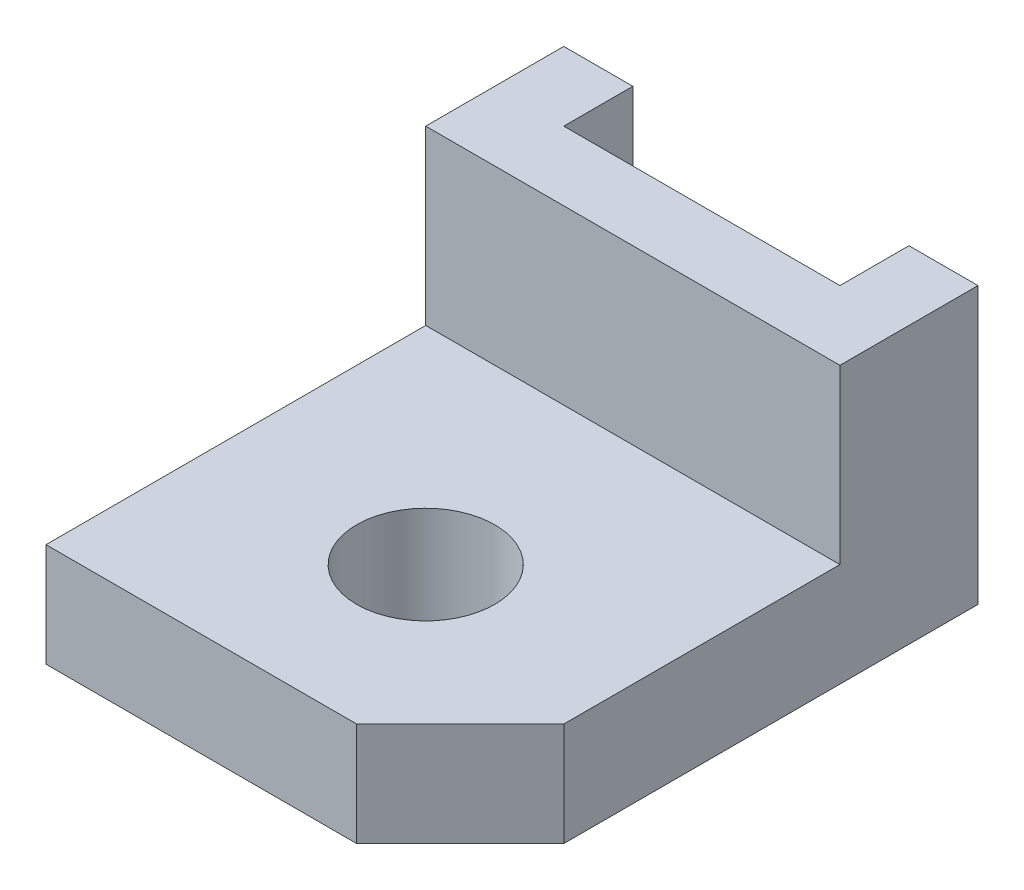
ISO-10303-21;
HEADER;
FILE_DESCRIPTION(('STEP AP214'),'2;1');
FILE_NAME('part.step','',(''),(''),'','','');
FILE_SCHEMA(('AUTOMOTIVE_DESIGN { 1 0 10303 214 1 1 1 1 }'));
ENDSEC;
DATA;
#1=APPLICATION_CONTEXT('core data for automotive mechanical design processes');
#2=APPLICATION_PROTOCOL_DEFINITION('international standard','automotive_design',2000,#1);
#3=PRODUCT_CONTEXT('',#1,'mechanical');
#4=PRODUCT('Part','Part','',(#3));
#5=PRODUCT_RELATED_PRODUCT_CATEGORY('part','',(#4));
#6=PRODUCT_DEFINITION_FORMATION('','',#4);
#7=PRODUCT_DEFINITION_CONTEXT('part definition',#1,'design');
#8=PRODUCT_DEFINITION('design','',#6,#7);
#9=PRODUCT_DEFINITION_SHAPE('','',#8);
#10=(LENGTH_UNIT() NAMED_UNIT(*) SI_UNIT(.MILLI.,.METRE.));
#11=(NAMED_UNIT(*) PLANE_ANGLE_UNIT() SI_UNIT($,.RADIAN.));
#12=(NAMED_UNIT(*) SI_UNIT($,.STERADIAN.) SOLID_ANGLE_UNIT());
#13=UNCERTAINTY_MEASURE_WITH_UNIT(LENGTH_MEASURE(1.E-05),#10,'distance_accuracy_value','');
#14=(GEOMETRIC_REPRESENTATION_CONTEXT(3) GLOBAL_UNCERTAINTY_ASSIGNED_CONTEXT((#13)) GLOBAL_UNIT_ASSIGNED_CONTEXT((#10,
#11,#12)) REPRESENTATION_CONTEXT('',''));
#15=CARTESIAN_POINT('',(0.,0.,0.));
#16=DIRECTION('',(0.,0.,1.));
#17=DIRECTION('',(1.,0.,0.));
#18=AXIS2_PLACEMENT_3D('',#15,#16,#17);
#19=CARTESIAN_POINT('',(30.,15.,-50.));
#20=DIRECTION('',(0.,0.,1.));
#21=DIRECTION('',(1.,0.,0.));
#22=AXIS2_PLACEMENT_3D('',#19,#20,#21);
#23=PLANE('',#22);
#24=DIRECTION('',(0.,-1.,0.));
#25=VECTOR('',#24,1.);
#26=CARTESIAN_POINT('',(-20.,40.,-50.));
#27=LINE('',#26,#25);
#28=CARTESIAN_POINT('',(-20.,40.,-50.));
#29=VERTEX_POINT('',#28);
#30=CARTESIAN_POINT('',(-20.,0.,-50.));
#31=VERTEX_POINT('',#30);
#32=EDGE_CURVE('E173',#29,#31,#27,.T.);
#33=ORIENTED_EDGE('',*,*,#32,.T.);
#34=DIRECTION('',(-1.,0.,0.));
#35=VECTOR('',#34,1.);
#36=CARTESIAN_POINT('',(30.,0.,-50.));
#37=LINE('',#36,#35);
#38=CARTESIAN_POINT('',(-30.,0.,-50.));
#39=VERTEX_POINT('',#38);
#40=EDGE_CURVE('E195',#31,#39,#37,.T.);
#41=ORIENTED_EDGE('',*,*,#40,.T.);
#42=DIRECTION('',(0.,-1.,0.));
#43=VECTOR('',#42,1.);
#44=CARTESIAN_POINT('',(-30.,15.,-50.));
#45=LINE('',#44,#43);
#46=CARTESIAN_POINT('',(-30.,40.,-50.));
#47=VERTEX_POINT('',#46);
#48=EDGE_CURVE('E47',#47,#39,#45,.T.);
#49=ORIENTED_EDGE('',*,*,#48,.F.);
#50=DIRECTION('',(-1.,0.,0.));
#51=VECTOR('',#50,1.);
#52=CARTESIAN_POINT('',(-30.,40.,-50.));
#53=LINE('',#52,#51);
#54=EDGE_CURVE('E156',#29,#47,#53,.T.);
#55=ORIENTED_EDGE('',*,*,#54,.F.);
#56=EDGE_LOOP('',(#33,#41,#49,#55));
#57=FACE_BOUND('',#56,.T.);
#58=ADVANCED_FACE('F39',(#57),#23,.F.);
#59=CARTESIAN_POINT('',(0.,15.,0.));
#60=DIRECTION('',(0.,1.,0.));
#61=DIRECTION('',(0.,0.,1.));
#62=AXIS2_PLACEMENT_3D('',#59,#60,#61);
#63=PLANE('',#62);
#64=DIRECTION('',(1.,0.,0.));
#65=VECTOR('',#64,1.);
#66=CARTESIAN_POINT('',(30.,15.,-30.));
#67=LINE('',#66,#65);
#68=CARTESIAN_POINT('',(-30.,15.,-30.));
#69=VERTEX_POINT('',#68);
#70=CARTESIAN_POINT('',(30.,15.,-30.));
#71=VERTEX_POINT('',#70);
#72=EDGE_CURVE('E54',#69,#71,#67,.T.);
#73=ORIENTED_EDGE('',*,*,#72,.F.);
#74=DIRECTION('',(0.,0.,1.));
#75=VECTOR('',#74,1.);
#76=CARTESIAN_POINT('',(-30.,15.,-50.));
#77=LINE('',#76,#75);
#78=CARTESIAN_POINT('',(-30.,15.,25.));
#79=VERTEX_POINT('',#78);
#80=EDGE_CURVE('E185',#69,#79,#77,.T.);
#81=ORIENTED_EDGE('',*,*,#80,.T.);
#82=DIRECTION('',(1.,0.,0.));
#83=VECTOR('',#82,1.);
#84=CARTESIAN_POINT('',(-30.,15.,25.));
#85=LINE('',#84,#83);
#86=CARTESIAN_POINT('',(15.,15.,25.));
#87=VERTEX_POINT('',#86);
#88=EDGE_CURVE('E188',#79,#87,#85,.T.);
#89=ORIENTED_EDGE('',*,*,#88,.T.);
#90=DIRECTION('',(0.707106781186547,0.,-0.707106781186548));
#91=VECTOR('',#90,1.);
#92=CARTESIAN_POINT('',(15.,15.,25.));
#93=LINE('',#92,#91);
#94=CARTESIAN_POINT('',(30.,15.,10.));
#95=VERTEX_POINT('',#94);
#96=EDGE_CURVE('E190',#87,#95,#93,.T.);
#97=ORIENTED_EDGE('',*,*,#96,.T.);
#98=DIRECTION('',(0.,0.,-1.));
#99=VECTOR('',#98,1.);
#100=CARTESIAN_POINT('',(30.,15.,10.));
#101=LINE('',#100,#99);
#102=EDGE_CURVE('E59',#95,#71,#101,.T.);
#103=ORIENTED_EDGE('',*,*,#102,.T.);
#104=EDGE_LOOP('',(#73,#81,#89,#97,#103));
#105=FACE_BOUND('',#104,.T.);
#106=CARTESIAN_POINT('',(0.,15.,0.));
#107=DIRECTION('',(0.,1.,0.));
#108=DIRECTION('',(0.,0.,1.));
#109=AXIS2_PLACEMENT_3D('',#106,#107,#108);
#110=CIRCLE('',#109,10.);
#111=CARTESIAN_POINT('',(0.,15.,10.));
#112=VERTEX_POINT('',#111);
#113=EDGE_CURVE('E178',#112,#112,#110,.T.);
#114=ORIENTED_EDGE('',*,*,#113,.F.);
#115=EDGE_LOOP('',(#114));
#116=FACE_BOUND('',#115,.T.);
#117=ADVANCED_FACE('F230',(#105,#116),#63,.T.);
#118=CARTESIAN_POINT('',(0.,0.,0.));
#119=DIRECTION('',(0.,1.,0.));
#120=DIRECTION('',(0.,0.,1.));
#121=AXIS2_PLACEMENT_3D('',#118,#119,#120);
#122=PLANE('',#121);
#123=ORIENTED_EDGE('',*,*,#40,.F.);
#124=DIRECTION('',(0.,0.,1.));
#125=VECTOR('',#124,1.);
#126=CARTESIAN_POINT('',(-20.,0.,-50.));
#127=LINE('',#126,#125);
#128=CARTESIAN_POINT('',(-20.,0.,-40.));
#129=VERTEX_POINT('',#128);
#130=EDGE_CURVE('E139',#31,#129,#127,.T.);
#131=ORIENTED_EDGE('',*,*,#130,.T.);
#132=DIRECTION('',(1.,0.,0.));
#133=VECTOR('',#132,1.);
#134=CARTESIAN_POINT('',(-20.,0.,-40.));
#135=LINE('',#134,#133);
#136=CARTESIAN_POINT('',(20.,0.,-40.));
#137=VERTEX_POINT('',#136);
#138=EDGE_CURVE('E126',#129,#137,#135,.T.);
#139=ORIENTED_EDGE('',*,*,#138,.T.);
#140=DIRECTION('',(0.,0.,-1.));
#141=VECTOR('',#140,1.);
#142=CARTESIAN_POINT('',(20.,0.,-40.));
#143=LINE('',#142,#141);
#144=CARTESIAN_POINT('',(20.,0.,-50.));
#145=VERTEX_POINT('',#144);
#146=EDGE_CURVE('E134',#137,#145,#143,.T.);
#147=ORIENTED_EDGE('',*,*,#146,.T.);
#148=CARTESIAN_POINT('',(30.,0.,-50.));
#149=VERTEX_POINT('',#148);
#150=EDGE_CURVE('E196',#149,#145,#37,.T.);
#151=ORIENTED_EDGE('',*,*,#150,.F.);
#152=DIRECTION('',(0.,0.,-1.));
#153=VECTOR('',#152,1.);
#154=CARTESIAN_POINT('',(30.,0.,10.));
#155=LINE('',#154,#153);
#156=CARTESIAN_POINT('',(30.,0.,10.));
#157=VERTEX_POINT('',#156);
#158=EDGE_CURVE('E181',#157,#149,#155,.T.);
#159=ORIENTED_EDGE('',*,*,#158,.F.);
#160=DIRECTION('',(0.707106781186547,0.,-0.707106781186548));
#161=VECTOR('',#160,1.);
#162=CARTESIAN_POINT('',(15.,0.,25.));
#163=LINE('',#162,#161);
#164=CARTESIAN_POINT('',(15.,0.,25.));
#165=VERTEX_POINT('',#164);
#166=EDGE_CURVE('E186',#165,#157,#163,.T.);
#167=ORIENTED_EDGE('',*,*,#166,.F.);
#168=DIRECTION('',(1.,0.,0.));
#169=VECTOR('',#168,1.);
#170=CARTESIAN_POINT('',(-30.,0.,25.));
#171=LINE('',#170,#169);
#172=CARTESIAN_POINT('',(-30.,0.,25.));
#173=VERTEX_POINT('',#172);
#174=EDGE_CURVE('E200',#173,#165,#171,.T.);
#175=ORIENTED_EDGE('',*,*,#174,.F.);
#176=DIRECTION('',(0.,0.,1.));
#177=VECTOR('',#176,1.);
#178=CARTESIAN_POINT('',(-30.,0.,-50.));
#179=LINE('',#178,#177);
#180=EDGE_CURVE('E198',#39,#173,#179,.T.);
#181=ORIENTED_EDGE('',*,*,#180,.F.);
#182=EDGE_LOOP('',(#123,#131,#139,#147,#151,#159,#167,#175,#181));
#183=FACE_BOUND('',#182,.T.);
#184=CARTESIAN_POINT('',(0.,0.,0.));
#185=DIRECTION('',(0.,1.,0.));
#186=DIRECTION('',(0.,0.,1.));
#187=AXIS2_PLACEMENT_3D('',#184,#185,#186);
#188=CIRCLE('',#187,10.);
#189=CARTESIAN_POINT('',(0.,0.,10.));
#190=VERTEX_POINT('',#189);
#191=EDGE_CURVE('E177',#190,#190,#188,.T.);
#192=ORIENTED_EDGE('',*,*,#191,.T.);
#193=EDGE_LOOP('',(#192));
#194=FACE_BOUND('',#193,.T.);
#195=ADVANCED_FACE('F142',(#183,#194),#122,.F.);
#196=CARTESIAN_POINT('',(30.,15.,10.));
#197=DIRECTION('',(-1.,0.,0.));
#198=DIRECTION('',(0.,0.,1.));
#199=AXIS2_PLACEMENT_3D('',#196,#197,#198);
#200=PLANE('',#199);
#201=ORIENTED_EDGE('',*,*,#158,.T.);
#202=DIRECTION('',(0.,-1.,0.));
#203=VECTOR('',#202,1.);
#204=CARTESIAN_POINT('',(30.,15.,-50.));
#205=LINE('',#204,#203);
#206=CARTESIAN_POINT('',(30.,40.,-50.));
#207=VERTEX_POINT('',#206);
#208=EDGE_CURVE('E11',#207,#149,#205,.T.);
#209=ORIENTED_EDGE('',*,*,#208,.F.);
#210=DIRECTION('',(0.,0.,-1.));
#211=VECTOR('',#210,1.);
#212=CARTESIAN_POINT('',(30.,40.,-50.));
#213=LINE('',#212,#211);
#214=CARTESIAN_POINT('',(30.,40.,-30.));
#215=VERTEX_POINT('',#214);
#216=EDGE_CURVE('E163',#215,#207,#213,.T.);
#217=ORIENTED_EDGE('',*,*,#216,.F.);
#218=DIRECTION('',(0.,-1.,0.));
#219=VECTOR('',#218,1.);
#220=CARTESIAN_POINT('',(30.,40.,-30.));
#221=LINE('',#220,#219);
#222=EDGE_CURVE('E166',#215,#71,#221,.T.);
#223=ORIENTED_EDGE('',*,*,#222,.T.);
#224=ORIENTED_EDGE('',*,*,#102,.F.);
#225=DIRECTION('',(0.,-1.,0.));
#226=VECTOR('',#225,1.);
#227=CARTESIAN_POINT('',(30.,15.,10.));
#228=LINE('',#227,#226);
#229=EDGE_CURVE('E192',#95,#157,#228,.T.);
#230=ORIENTED_EDGE('',*,*,#229,.T.);
#231=EDGE_LOOP('',(#201,#209,#217,#223,#224,#230));
#232=FACE_BOUND('',#231,.T.);
#233=ADVANCED_FACE('F41',(#232),#200,.F.);
#234=ORIENTED_EDGE('',*,*,#150,.T.);
#235=DIRECTION('',(0.,-1.,0.));
#236=VECTOR('',#235,1.);
#237=CARTESIAN_POINT('',(20.,40.,-50.));
#238=LINE('',#237,#236);
#239=CARTESIAN_POINT('',(20.,40.,-50.));
#240=VERTEX_POINT('',#239);
#241=EDGE_CURVE('E130',#240,#145,#238,.T.);
#242=ORIENTED_EDGE('',*,*,#241,.F.);
#243=DIRECTION('',(-1.,0.,0.));
#244=VECTOR('',#243,1.);
#245=CARTESIAN_POINT('',(20.,40.,-50.));
#246=LINE('',#245,#244);
#247=EDGE_CURVE('E148',#207,#240,#246,.T.);
#248=ORIENTED_EDGE('',*,*,#247,.F.);
#249=ORIENTED_EDGE('',*,*,#208,.T.);
#250=EDGE_LOOP('',(#234,#242,#248,#249));
#251=FACE_BOUND('',#250,.T.);
#252=ADVANCED_FACE('F253',(#251),#23,.F.);
#253=CARTESIAN_POINT('',(-30.,15.,-50.));
#254=DIRECTION('',(1.,0.,0.));
#255=DIRECTION('',(0.,0.,-1.));
#256=AXIS2_PLACEMENT_3D('',#253,#254,#255);
#257=PLANE('',#256);
#258=ORIENTED_EDGE('',*,*,#180,.T.);
#259=DIRECTION('',(0.,-1.,0.));
#260=VECTOR('',#259,1.);
#261=CARTESIAN_POINT('',(-30.,15.,25.));
#262=LINE('',#261,#260);
#263=EDGE_CURVE('E208',#79,#173,#262,.T.);
#264=ORIENTED_EDGE('',*,*,#263,.F.);
#265=ORIENTED_EDGE('',*,*,#80,.F.);
#266=DIRECTION('',(0.,-1.,0.));
#267=VECTOR('',#266,1.);
#268=CARTESIAN_POINT('',(-30.,40.,-30.));
#269=LINE('',#268,#267);
#270=CARTESIAN_POINT('',(-30.,40.,-30.));
#271=VERTEX_POINT('',#270);
#272=EDGE_CURVE('E170',#271,#69,#269,.T.);
#273=ORIENTED_EDGE('',*,*,#272,.F.);
#274=DIRECTION('',(0.,0.,1.));
#275=VECTOR('',#274,1.);
#276=CARTESIAN_POINT('',(-30.,40.,-30.));
#277=LINE('',#276,#275);
#278=EDGE_CURVE('E159',#47,#271,#277,.T.);
#279=ORIENTED_EDGE('',*,*,#278,.F.);
#280=ORIENTED_EDGE('',*,*,#48,.T.);
#281=EDGE_LOOP('',(#258,#264,#265,#273,#279,#280));
#282=FACE_BOUND('',#281,.T.);
#283=ADVANCED_FACE('F214',(#282),#257,.F.);
#284=CARTESIAN_POINT('',(-30.,15.,25.));
#285=DIRECTION('',(0.,0.,-1.));
#286=DIRECTION('',(-1.,0.,0.));
#287=AXIS2_PLACEMENT_3D('',#284,#285,#286);
#288=PLANE('',#287);
#289=ORIENTED_EDGE('',*,*,#174,.T.);
#290=DIRECTION('',(0.,-1.,0.));
#291=VECTOR('',#290,1.);
#292=CARTESIAN_POINT('',(15.,15.,25.));
#293=LINE('',#292,#291);
#294=EDGE_CURVE('E205',#87,#165,#293,.T.);
#295=ORIENTED_EDGE('',*,*,#294,.F.);
#296=ORIENTED_EDGE('',*,*,#88,.F.);
#297=ORIENTED_EDGE('',*,*,#263,.T.);
#298=EDGE_LOOP('',(#289,#295,#296,#297));
#299=FACE_BOUND('',#298,.T.);
#300=ADVANCED_FACE('F224',(#299),#288,.F.);
#301=CARTESIAN_POINT('',(15.,15.,25.));
#302=DIRECTION('',(-0.707106781186548,0.,-0.707106781186547));
#303=DIRECTION('',(-0.707106781186547,0.,0.707106781186548));
#304=AXIS2_PLACEMENT_3D('',#301,#302,#303);
#305=PLANE('',#304);
#306=ORIENTED_EDGE('',*,*,#166,.T.);
#307=ORIENTED_EDGE('',*,*,#229,.F.);
#308=ORIENTED_EDGE('',*,*,#96,.F.);
#309=ORIENTED_EDGE('',*,*,#294,.T.);
#310=EDGE_LOOP('',(#306,#307,#308,#309));
#311=FACE_BOUND('',#310,.T.);
#312=ADVANCED_FACE('F228',(#311),#305,.F.);
#313=CARTESIAN_POINT('',(0.,15.,0.));
#314=DIRECTION('',(0.,-1.,0.));
#315=DIRECTION('',(0.,0.,-1.));
#316=AXIS2_PLACEMENT_3D('',#313,#314,#315);
#317=CYLINDRICAL_SURFACE('',#316,10.);
#318=ORIENTED_EDGE('',*,*,#113,.T.);
#319=EDGE_LOOP('',(#318));
#320=FACE_BOUND('',#319,.T.);
#321=ORIENTED_EDGE('',*,*,#191,.F.);
#322=EDGE_LOOP('',(#321));
#323=FACE_BOUND('',#322,.T.);
#324=ADVANCED_FACE('F278',(#320,#323),#317,.F.);
#325=CARTESIAN_POINT('',(20.,40.,-40.));
#326=DIRECTION('',(1.,0.,0.));
#327=DIRECTION('',(0.,0.,-1.));
#328=AXIS2_PLACEMENT_3D('',#325,#326,#327);
#329=PLANE('',#328);
#330=ORIENTED_EDGE('',*,*,#241,.T.);
#331=ORIENTED_EDGE('',*,*,#146,.F.);
#332=DIRECTION('',(0.,-1.,0.));
#333=VECTOR('',#332,1.);
#334=CARTESIAN_POINT('',(20.,40.,-40.));
#335=LINE('',#334,#333);
#336=CARTESIAN_POINT('',(20.,40.,-40.));
#337=VERTEX_POINT('',#336);
#338=EDGE_CURVE('E121',#337,#137,#335,.T.);
#339=ORIENTED_EDGE('',*,*,#338,.F.);
#340=DIRECTION('',(0.,0.,1.));
#341=VECTOR('',#340,1.);
#342=CARTESIAN_POINT('',(20.,40.,-40.));
#343=LINE('',#342,#341);
#344=EDGE_CURVE('E151',#240,#337,#343,.T.);
#345=ORIENTED_EDGE('',*,*,#344,.F.);
#346=EDGE_LOOP('',(#330,#331,#339,#345));
#347=FACE_BOUND('',#346,.T.);
#348=ADVANCED_FACE('F135',(#347),#329,.F.);
#349=CARTESIAN_POINT('',(-20.,40.,-40.));
#350=DIRECTION('',(0.,0.,1.));
#351=DIRECTION('',(1.,0.,0.));
#352=AXIS2_PLACEMENT_3D('',#349,#350,#351);
#353=PLANE('',#352);
#354=ORIENTED_EDGE('',*,*,#338,.T.);
#355=ORIENTED_EDGE('',*,*,#138,.F.);
#356=DIRECTION('',(0.,-1.,0.));
#357=VECTOR('',#356,1.);
#358=CARTESIAN_POINT('',(-20.,40.,-40.));
#359=LINE('',#358,#357);
#360=CARTESIAN_POINT('',(-20.,40.,-40.));
#361=VERTEX_POINT('',#360);
#362=EDGE_CURVE('E131',#361,#129,#359,.T.);
#363=ORIENTED_EDGE('',*,*,#362,.F.);
#364=DIRECTION('',(-1.,0.,0.));
#365=VECTOR('',#364,1.);
#366=CARTESIAN_POINT('',(-20.,40.,-40.));
#367=LINE('',#366,#365);
#368=EDGE_CURVE('E128',#337,#361,#367,.T.);
#369=ORIENTED_EDGE('',*,*,#368,.F.);
#370=EDGE_LOOP('',(#354,#355,#363,#369));
#371=FACE_BOUND('',#370,.T.);
#372=ADVANCED_FACE('F123',(#371),#353,.F.);
#373=CARTESIAN_POINT('',(-20.,40.,-50.));
#374=DIRECTION('',(-1.,0.,0.));
#375=DIRECTION('',(0.,0.,1.));
#376=AXIS2_PLACEMENT_3D('',#373,#374,#375);
#377=PLANE('',#376);
#378=ORIENTED_EDGE('',*,*,#362,.T.);
#379=ORIENTED_EDGE('',*,*,#130,.F.);
#380=ORIENTED_EDGE('',*,*,#32,.F.);
#381=DIRECTION('',(0.,0.,-1.));
#382=VECTOR('',#381,1.);
#383=CARTESIAN_POINT('',(-20.,40.,-50.));
#384=LINE('',#383,#382);
#385=EDGE_CURVE('E154',#361,#29,#384,.T.);
#386=ORIENTED_EDGE('',*,*,#385,.F.);
#387=EDGE_LOOP('',(#378,#379,#380,#386));
#388=FACE_BOUND('',#387,.T.);
#389=ADVANCED_FACE('F243',(#388),#377,.F.);
#390=CARTESIAN_POINT('',(30.,40.,-30.));
#391=DIRECTION('',(0.,0.,-1.));
#392=DIRECTION('',(-1.,0.,0.));
#393=AXIS2_PLACEMENT_3D('',#390,#391,#392);
#394=PLANE('',#393);
#395=ORIENTED_EDGE('',*,*,#72,.T.);
#396=ORIENTED_EDGE('',*,*,#222,.F.);
#397=DIRECTION('',(1.,0.,0.));
#398=VECTOR('',#397,1.);
#399=CARTESIAN_POINT('',(30.,40.,-30.));
#400=LINE('',#399,#398);
#401=EDGE_CURVE('E161',#271,#215,#400,.T.);
#402=ORIENTED_EDGE('',*,*,#401,.F.);
#403=ORIENTED_EDGE('',*,*,#272,.T.);
#404=EDGE_LOOP('',(#395,#396,#402,#403));
#405=FACE_BOUND('',#404,.T.);
#406=ADVANCED_FACE('F234',(#405),#394,.F.);
#407=CARTESIAN_POINT('',(0.,40.,0.));
#408=DIRECTION('',(0.,-1.,0.));
#409=DIRECTION('',(0.,0.,-1.));
#410=AXIS2_PLACEMENT_3D('',#407,#408,#409);
#411=PLANE('',#410);
#412=ORIENTED_EDGE('',*,*,#247,.T.);
#413=ORIENTED_EDGE('',*,*,#344,.T.);
#414=ORIENTED_EDGE('',*,*,#368,.T.);
#415=ORIENTED_EDGE('',*,*,#385,.T.);
#416=ORIENTED_EDGE('',*,*,#54,.T.);
#417=ORIENTED_EDGE('',*,*,#278,.T.);
#418=ORIENTED_EDGE('',*,*,#401,.T.);
#419=ORIENTED_EDGE('',*,*,#216,.T.);
#420=EDGE_LOOP('',(#412,#413,#414,#415,#416,#417,#418,#419));
#421=FACE_BOUND('',#420,.T.);
#422=ADVANCED_FACE('F238',(#421),#411,.F.);
#423=CLOSED_SHELL('',(#58,#117,#195,#233,#252,#283,#300,#312,#324,#348,#372,#389,#406,#422));
#424=MANIFOLD_SOLID_BREP('B2',#423);
#425=ADVANCED_BREP_SHAPE_REPRESENTATION('',(#18,#424),#14);
#426=SHAPE_DEFINITION_REPRESENTATION(#9,#425);
ENDSEC;
END-ISO-10303-21;
